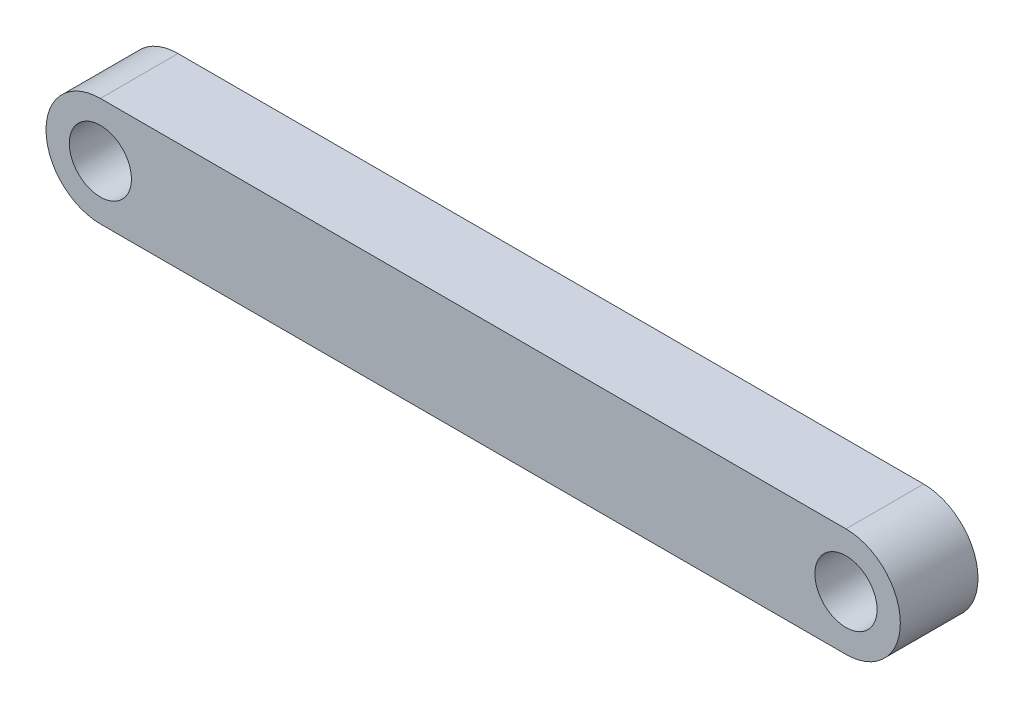
ISO-10303-21;
HEADER;
FILE_DESCRIPTION(('STEP AP214'),'2;1');
FILE_NAME('part.step','',(''),(''),'','','');
FILE_SCHEMA(('AUTOMOTIVE_DESIGN { 1 0 10303 214 1 1 1 1 }'));
ENDSEC;
DATA;
#1=APPLICATION_CONTEXT('core data for automotive mechanical design processes');
#2=APPLICATION_PROTOCOL_DEFINITION('international standard','automotive_design',2000,#1);
#3=PRODUCT_CONTEXT('',#1,'mechanical');
#4=PRODUCT('Part','Part','',(#3));
#5=PRODUCT_RELATED_PRODUCT_CATEGORY('part','',(#4));
#6=PRODUCT_DEFINITION_FORMATION('','',#4);
#7=PRODUCT_DEFINITION_CONTEXT('part definition',#1,'design');
#8=PRODUCT_DEFINITION('design','',#6,#7);
#9=PRODUCT_DEFINITION_SHAPE('','',#8);
#10=(LENGTH_UNIT() NAMED_UNIT(*) SI_UNIT(.MILLI.,.METRE.));
#11=(NAMED_UNIT(*) PLANE_ANGLE_UNIT() SI_UNIT($,.RADIAN.));
#12=(NAMED_UNIT(*) SI_UNIT($,.STERADIAN.) SOLID_ANGLE_UNIT());
#13=UNCERTAINTY_MEASURE_WITH_UNIT(LENGTH_MEASURE(1.E-05),#10,'distance_accuracy_value','');
#14=(GEOMETRIC_REPRESENTATION_CONTEXT(3) GLOBAL_UNCERTAINTY_ASSIGNED_CONTEXT((#13)) GLOBAL_UNIT_ASSIGNED_CONTEXT((#10,
#11,#12)) REPRESENTATION_CONTEXT('',''));
#15=CARTESIAN_POINT('',(0.,0.,0.));
#16=DIRECTION('',(0.,0.,1.));
#17=DIRECTION('',(1.,0.,0.));
#18=AXIS2_PLACEMENT_3D('',#15,#16,#17);
#19=CARTESIAN_POINT('',(609.6,0.,31.75));
#20=DIRECTION('',(0.,0.,1.));
#21=DIRECTION('',(1.,0.,0.));
#22=AXIS2_PLACEMENT_3D('',#19,#20,#21);
#23=PLANE('',#22);
#24=CARTESIAN_POINT('',(609.6,0.,31.75));
#25=DIRECTION('',(0.,0.,1.));
#26=DIRECTION('',(1.,0.,0.));
#27=AXIS2_PLACEMENT_3D('',#24,#25,#26);
#28=CIRCLE('',#27,25.4);
#29=CARTESIAN_POINT('',(635.,0.,31.75));
#30=VERTEX_POINT('',#29);
#31=EDGE_CURVE('E119',#30,#30,#28,.T.);
#32=ORIENTED_EDGE('',*,*,#31,.F.);
#33=EDGE_LOOP('',(#32));
#34=FACE_BOUND('',#33,.T.);
#35=CARTESIAN_POINT('',(609.6,0.,31.75));
#36=DIRECTION('',(0.,0.,1.));
#37=DIRECTION('',(1.,0.,0.));
#38=AXIS2_PLACEMENT_3D('',#35,#36,#37);
#39=CIRCLE('',#38,44.4499999999999);
#40=CARTESIAN_POINT('',(609.6,-44.4499999999999,31.75));
#41=VERTEX_POINT('',#40);
#42=CARTESIAN_POINT('',(609.6,44.4499999999999,31.75));
#43=VERTEX_POINT('',#42);
#44=EDGE_CURVE('E98',#41,#43,#39,.T.);
#45=ORIENTED_EDGE('',*,*,#44,.T.);
#46=DIRECTION('',(-1.,0.,0.));
#47=VECTOR('',#46,1.);
#48=CARTESIAN_POINT('',(609.6,44.4499999999999,31.75));
#49=LINE('',#48,#47);
#50=CARTESIAN_POINT('',(0.,44.4499999999999,31.75));
#51=VERTEX_POINT('',#50);
#52=EDGE_CURVE('E91',#43,#51,#49,.T.);
#53=ORIENTED_EDGE('',*,*,#52,.T.);
#54=CARTESIAN_POINT('',(0.,0.,31.75));
#55=DIRECTION('',(0.,0.,1.));
#56=DIRECTION('',(1.,0.,0.));
#57=AXIS2_PLACEMENT_3D('',#54,#55,#56);
#58=CIRCLE('',#57,44.4499999999999);
#59=CARTESIAN_POINT('',(0.,-44.45,31.75));
#60=VERTEX_POINT('',#59);
#61=EDGE_CURVE('E96',#51,#60,#58,.T.);
#62=ORIENTED_EDGE('',*,*,#61,.T.);
#63=DIRECTION('',(1.,0.,0.));
#64=VECTOR('',#63,1.);
#65=CARTESIAN_POINT('',(609.6,-44.4499999999999,31.75));
#66=LINE('',#65,#64);
#67=EDGE_CURVE('E64',#60,#41,#66,.T.);
#68=ORIENTED_EDGE('',*,*,#67,.T.);
#69=EDGE_LOOP('',(#45,#53,#62,#68));
#70=FACE_BOUND('',#69,.T.);
#71=CARTESIAN_POINT('',(0.,0.,31.75));
#72=DIRECTION('',(0.,0.,1.));
#73=DIRECTION('',(1.,0.,0.));
#74=AXIS2_PLACEMENT_3D('',#71,#72,#73);
#75=CIRCLE('',#74,25.4);
#76=CARTESIAN_POINT('',(25.4,0.,31.75));
#77=VERTEX_POINT('',#76);
#78=EDGE_CURVE('E140',#77,#77,#75,.T.);
#79=ORIENTED_EDGE('',*,*,#78,.F.);
#80=EDGE_LOOP('',(#79));
#81=FACE_BOUND('',#80,.T.);
#82=ADVANCED_FACE('F44',(#34,#70,#81),#23,.T.);
#83=CARTESIAN_POINT('',(609.6,0.,-31.75));
#84=DIRECTION('',(0.,0.,1.));
#85=DIRECTION('',(1.,0.,0.));
#86=AXIS2_PLACEMENT_3D('',#83,#84,#85);
#87=PLANE('',#86);
#88=CARTESIAN_POINT('',(609.6,0.,-31.75));
#89=DIRECTION('',(0.,0.,1.));
#90=DIRECTION('',(1.,0.,0.));
#91=AXIS2_PLACEMENT_3D('',#88,#89,#90);
#92=CIRCLE('',#91,44.4499999999999);
#93=CARTESIAN_POINT('',(609.6,-44.4499999999999,-31.75));
#94=VERTEX_POINT('',#93);
#95=CARTESIAN_POINT('',(609.6,44.4499999999999,-31.75));
#96=VERTEX_POINT('',#95);
#97=EDGE_CURVE('E111',#94,#96,#92,.T.);
#98=ORIENTED_EDGE('',*,*,#97,.F.);
#99=DIRECTION('',(1.,0.,0.));
#100=VECTOR('',#99,1.);
#101=CARTESIAN_POINT('',(609.6,-44.4499999999999,-31.75));
#102=LINE('',#101,#100);
#103=CARTESIAN_POINT('',(0.,-44.45,-31.75));
#104=VERTEX_POINT('',#103);
#105=EDGE_CURVE('E88',#104,#94,#102,.T.);
#106=ORIENTED_EDGE('',*,*,#105,.F.);
#107=CARTESIAN_POINT('',(0.,0.,-31.75));
#108=DIRECTION('',(0.,0.,1.));
#109=DIRECTION('',(1.,0.,0.));
#110=AXIS2_PLACEMENT_3D('',#107,#108,#109);
#111=CIRCLE('',#110,44.4499999999999);
#112=CARTESIAN_POINT('',(0.,44.4499999999999,-31.75));
#113=VERTEX_POINT('',#112);
#114=EDGE_CURVE('E78',#113,#104,#111,.T.);
#115=ORIENTED_EDGE('',*,*,#114,.F.);
#116=DIRECTION('',(-1.,0.,0.));
#117=VECTOR('',#116,1.);
#118=CARTESIAN_POINT('',(609.6,44.4499999999999,-31.75));
#119=LINE('',#118,#117);
#120=EDGE_CURVE('E103',#96,#113,#119,.T.);
#121=ORIENTED_EDGE('',*,*,#120,.F.);
#122=EDGE_LOOP('',(#98,#106,#115,#121));
#123=FACE_BOUND('',#122,.T.);
#124=CARTESIAN_POINT('',(609.6,0.,-31.75));
#125=DIRECTION('',(0.,0.,1.));
#126=DIRECTION('',(1.,0.,0.));
#127=AXIS2_PLACEMENT_3D('',#124,#125,#126);
#128=CIRCLE('',#127,25.4);
#129=CARTESIAN_POINT('',(635.,0.,-31.75));
#130=VERTEX_POINT('',#129);
#131=EDGE_CURVE('E136',#130,#130,#128,.T.);
#132=ORIENTED_EDGE('',*,*,#131,.T.);
#133=EDGE_LOOP('',(#132));
#134=FACE_BOUND('',#133,.T.);
#135=CARTESIAN_POINT('',(0.,0.,-31.75));
#136=DIRECTION('',(0.,0.,1.));
#137=DIRECTION('',(1.,0.,0.));
#138=AXIS2_PLACEMENT_3D('',#135,#136,#137);
#139=CIRCLE('',#138,25.4);
#140=CARTESIAN_POINT('',(25.4,0.,-31.75));
#141=VERTEX_POINT('',#140);
#142=EDGE_CURVE('E145',#141,#141,#139,.T.);
#143=ORIENTED_EDGE('',*,*,#142,.T.);
#144=EDGE_LOOP('',(#143));
#145=FACE_BOUND('',#144,.T.);
#146=ADVANCED_FACE('F132',(#123,#134,#145),#87,.F.);
#147=CARTESIAN_POINT('',(609.6,0.,31.75));
#148=DIRECTION('',(0.,0.,-1.));
#149=DIRECTION('',(-1.,0.,0.));
#150=AXIS2_PLACEMENT_3D('',#147,#148,#149);
#151=CYLINDRICAL_SURFACE('',#150,44.4499999999999);
#152=ORIENTED_EDGE('',*,*,#97,.T.);
#153=DIRECTION('',(0.,0.,-1.));
#154=VECTOR('',#153,1.);
#155=CARTESIAN_POINT('',(609.6,44.4499999999999,31.75));
#156=LINE('',#155,#154);
#157=EDGE_CURVE('E11',#43,#96,#156,.T.);
#158=ORIENTED_EDGE('',*,*,#157,.F.);
#159=ORIENTED_EDGE('',*,*,#44,.F.);
#160=DIRECTION('',(0.,0.,-1.));
#161=VECTOR('',#160,1.);
#162=CARTESIAN_POINT('',(609.6,-44.4499999999999,31.75));
#163=LINE('',#162,#161);
#164=EDGE_CURVE('E109',#41,#94,#163,.T.);
#165=ORIENTED_EDGE('',*,*,#164,.T.);
#166=EDGE_LOOP('',(#152,#158,#159,#165));
#167=FACE_BOUND('',#166,.T.);
#168=ADVANCED_FACE('F50',(#167),#151,.T.);
#169=CARTESIAN_POINT('',(609.6,44.4499999999999,31.75));
#170=DIRECTION('',(0.,-1.,0.));
#171=DIRECTION('',(1.,0.,0.));
#172=AXIS2_PLACEMENT_3D('',#169,#170,#171);
#173=PLANE('',#172);
#174=ORIENTED_EDGE('',*,*,#120,.T.);
#175=DIRECTION('',(0.,0.,-1.));
#176=VECTOR('',#175,1.);
#177=CARTESIAN_POINT('',(0.,44.4499999999999,31.75));
#178=LINE('',#177,#176);
#179=EDGE_CURVE('E54',#51,#113,#178,.T.);
#180=ORIENTED_EDGE('',*,*,#179,.F.);
#181=ORIENTED_EDGE('',*,*,#52,.F.);
#182=ORIENTED_EDGE('',*,*,#157,.T.);
#183=EDGE_LOOP('',(#174,#180,#181,#182));
#184=FACE_BOUND('',#183,.T.);
#185=ADVANCED_FACE('F105',(#184),#173,.F.);
#186=CARTESIAN_POINT('',(0.,0.,31.75));
#187=DIRECTION('',(0.,0.,-1.));
#188=DIRECTION('',(-1.,0.,0.));
#189=AXIS2_PLACEMENT_3D('',#186,#187,#188);
#190=CYLINDRICAL_SURFACE('',#189,44.4499999999999);
#191=ORIENTED_EDGE('',*,*,#114,.T.);
#192=DIRECTION('',(0.,0.,-1.));
#193=VECTOR('',#192,1.);
#194=CARTESIAN_POINT('',(0.,-44.45,31.75));
#195=LINE('',#194,#193);
#196=EDGE_CURVE('E104',#60,#104,#195,.T.);
#197=ORIENTED_EDGE('',*,*,#196,.F.);
#198=ORIENTED_EDGE('',*,*,#61,.F.);
#199=ORIENTED_EDGE('',*,*,#179,.T.);
#200=EDGE_LOOP('',(#191,#197,#198,#199));
#201=FACE_BOUND('',#200,.T.);
#202=ADVANCED_FACE('F106',(#201),#190,.T.);
#203=CARTESIAN_POINT('',(609.6,-44.4499999999999,31.75));
#204=DIRECTION('',(0.,1.,0.));
#205=DIRECTION('',(-1.,0.,0.));
#206=AXIS2_PLACEMENT_3D('',#203,#204,#205);
#207=PLANE('',#206);
#208=ORIENTED_EDGE('',*,*,#105,.T.);
#209=ORIENTED_EDGE('',*,*,#164,.F.);
#210=ORIENTED_EDGE('',*,*,#67,.F.);
#211=ORIENTED_EDGE('',*,*,#196,.T.);
#212=EDGE_LOOP('',(#208,#209,#210,#211));
#213=FACE_BOUND('',#212,.T.);
#214=ADVANCED_FACE('F126',(#213),#207,.F.);
#215=CARTESIAN_POINT('',(609.6,0.,31.75));
#216=DIRECTION('',(0.,0.,-1.));
#217=DIRECTION('',(-1.,0.,0.));
#218=AXIS2_PLACEMENT_3D('',#215,#216,#217);
#219=CYLINDRICAL_SURFACE('',#218,25.4);
#220=ORIENTED_EDGE('',*,*,#31,.T.);
#221=EDGE_LOOP('',(#220));
#222=FACE_BOUND('',#221,.T.);
#223=ORIENTED_EDGE('',*,*,#131,.F.);
#224=EDGE_LOOP('',(#223));
#225=FACE_BOUND('',#224,.T.);
#226=ADVANCED_FACE('F162',(#222,#225),#219,.F.);
#227=CARTESIAN_POINT('',(0.,0.,31.75));
#228=DIRECTION('',(0.,0.,-1.));
#229=DIRECTION('',(-1.,0.,0.));
#230=AXIS2_PLACEMENT_3D('',#227,#228,#229);
#231=CYLINDRICAL_SURFACE('',#230,25.4);
#232=ORIENTED_EDGE('',*,*,#78,.T.);
#233=EDGE_LOOP('',(#232));
#234=FACE_BOUND('',#233,.T.);
#235=ORIENTED_EDGE('',*,*,#142,.F.);
#236=EDGE_LOOP('',(#235));
#237=FACE_BOUND('',#236,.T.);
#238=ADVANCED_FACE('F155',(#234,#237),#231,.F.);
#239=CLOSED_SHELL('',(#82,#146,#168,#185,#202,#214,#226,#238));
#240=MANIFOLD_SOLID_BREP('B2',#239);
#241=ADVANCED_BREP_SHAPE_REPRESENTATION('',(#18,#240),#14);
#242=SHAPE_DEFINITION_REPRESENTATION(#9,#241);
ENDSEC;
END-ISO-10303-21;
